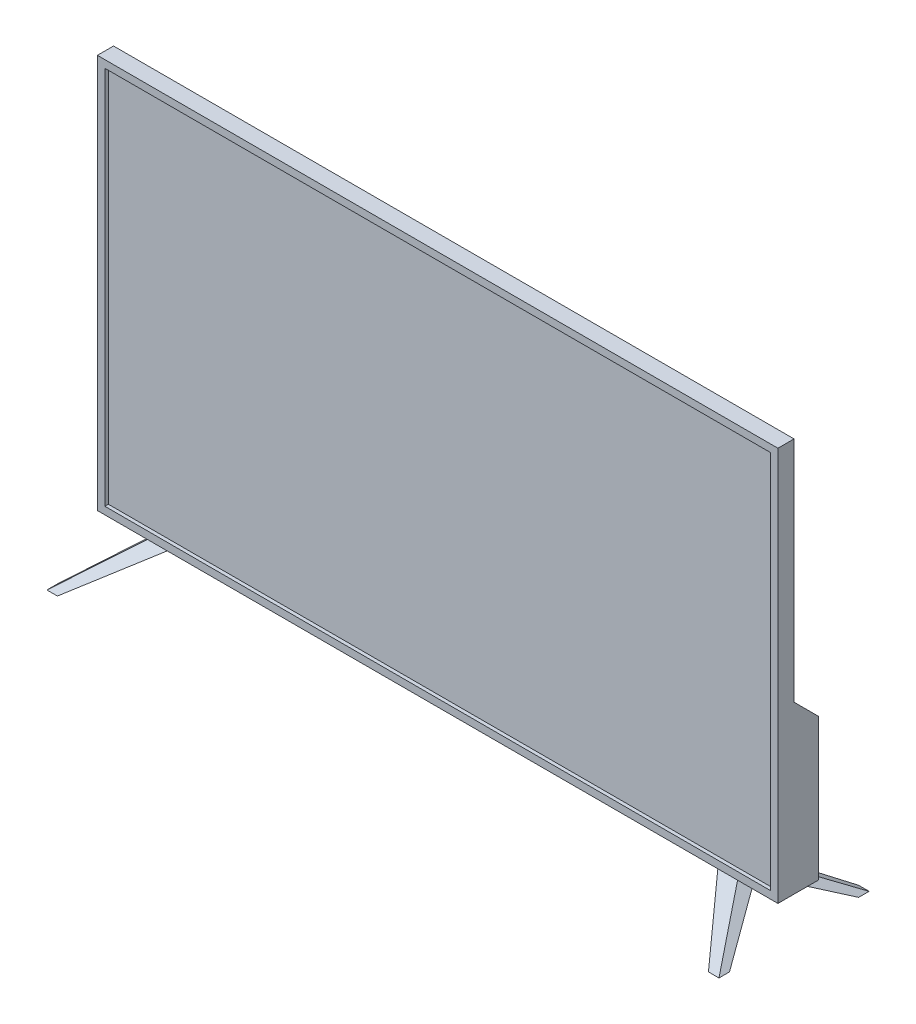
ISO-10303-21;
HEADER;
FILE_DESCRIPTION(('STEP AP214'),'2;1');
FILE_NAME('part.step','',(''),(''),'','','');
FILE_SCHEMA(('AUTOMOTIVE_DESIGN { 1 0 10303 214 1 1 1 1 }'));
ENDSEC;
DATA;
#1=APPLICATION_CONTEXT('core data for automotive mechanical design processes');
#2=APPLICATION_PROTOCOL_DEFINITION('international standard','automotive_design',2000,#1);
#3=PRODUCT_CONTEXT('',#1,'mechanical');
#4=PRODUCT('Part','Part','',(#3));
#5=PRODUCT_RELATED_PRODUCT_CATEGORY('part','',(#4));
#6=PRODUCT_DEFINITION_FORMATION('','',#4);
#7=PRODUCT_DEFINITION_CONTEXT('part definition',#1,'design');
#8=PRODUCT_DEFINITION('design','',#6,#7);
#9=PRODUCT_DEFINITION_SHAPE('','',#8);
#10=(LENGTH_UNIT() NAMED_UNIT(*) SI_UNIT(.MILLI.,.METRE.));
#11=(NAMED_UNIT(*) PLANE_ANGLE_UNIT() SI_UNIT($,.RADIAN.));
#12=(NAMED_UNIT(*) SI_UNIT($,.STERADIAN.) SOLID_ANGLE_UNIT());
#13=UNCERTAINTY_MEASURE_WITH_UNIT(LENGTH_MEASURE(1.E-05),#10,'distance_accuracy_value','');
#14=(GEOMETRIC_REPRESENTATION_CONTEXT(3) GLOBAL_UNCERTAINTY_ASSIGNED_CONTEXT((#13)) GLOBAL_UNIT_ASSIGNED_CONTEXT((#10,
#11,#12)) REPRESENTATION_CONTEXT('',''));
#15=CARTESIAN_POINT('',(0.,0.,0.));
#16=DIRECTION('',(0.,0.,1.));
#17=DIRECTION('',(1.,0.,0.));
#18=AXIS2_PLACEMENT_3D('',#15,#16,#17);
#19=CARTESIAN_POINT('',(608.33,-356.87,49.5299999999999));
#20=DIRECTION('',(0.,-0.866036909293288,-0.499980071344578));
#21=DIRECTION('',(0.,0.499980071344578,-0.866036909293288));
#22=AXIS2_PLACEMENT_3D('',#19,#20,#21);
#23=PLANE('',#22);
#24=DIRECTION('',(-1.,0.,0.));
#25=VECTOR('',#24,1.);
#26=CARTESIAN_POINT('',(608.33,-427.99,172.72));
#27=LINE('',#26,#25);
#28=CARTESIAN_POINT('',(-589.28,-427.99,172.72));
#29=VERTEX_POINT('',#28);
#30=CARTESIAN_POINT('',(-608.33,-427.99,172.72));
#31=VERTEX_POINT('',#30);
#32=EDGE_CURVE('E352',#29,#31,#27,.T.);
#33=ORIENTED_EDGE('',*,*,#32,.F.);
#34=DIRECTION('',(0.589493605926695,0.403870423537547,-0.699561269341824));
#35=VECTOR('',#34,1.);
#36=CARTESIAN_POINT('',(-105.373155365608,-96.4585629660364,-401.539810576688));
#37=LINE('',#36,#35);
#38=CARTESIAN_POINT('',(-485.472484494699,-356.87,49.5299999999999));
#39=VERTEX_POINT('',#38);
#40=EDGE_CURVE('E279',#29,#39,#37,.T.);
#41=ORIENTED_EDGE('',*,*,#40,.T.);
#42=DIRECTION('',(-1.,0.,0.));
#43=VECTOR('',#42,1.);
#44=CARTESIAN_POINT('',(608.33,-356.87,49.5299999999999));
#45=LINE('',#44,#43);
#46=CARTESIAN_POINT('',(-523.572484494699,-356.87,49.5300000000001));
#47=VERTEX_POINT('',#46);
#48=EDGE_CURVE('E356',#39,#47,#45,.T.);
#49=ORIENTED_EDGE('',*,*,#48,.T.);
#50=DIRECTION('',(-0.511873880846081,-0.429513184627224,0.743978194800729));
#51=VECTOR('',#50,1.);
#52=CARTESIAN_POINT('',(-226.997202288905,-108.013790084823,-381.524506460218));
#53=LINE('',#52,#51);
#54=EDGE_CURVE('E306',#47,#31,#53,.T.);
#55=ORIENTED_EDGE('',*,*,#54,.T.);
#56=EDGE_LOOP('',(#33,#41,#49,#55));
#57=FACE_BOUND('',#56,.T.);
#58=ADVANCED_FACE('F35',(#57),#23,.F.);
#59=CARTESIAN_POINT('',(608.33,-427.99,172.72));
#60=DIRECTION('',(0.,1.,0.));
#61=DIRECTION('',(0.,0.,1.));
#62=AXIS2_PLACEMENT_3D('',#59,#60,#61);
#63=PLANE('',#62);
#64=DIRECTION('',(-1.,0.,0.));
#65=VECTOR('',#64,1.);
#66=CARTESIAN_POINT('',(608.33,-427.99,153.67));
#67=LINE('',#66,#65);
#68=CARTESIAN_POINT('',(-589.28,-427.99,153.67));
#69=VERTEX_POINT('',#68);
#70=CARTESIAN_POINT('',(-608.33,-427.99,153.67));
#71=VERTEX_POINT('',#70);
#72=EDGE_CURVE('E348',#69,#71,#67,.T.);
#73=ORIENTED_EDGE('',*,*,#72,.F.);
#74=DIRECTION('',(0.,0.,1.));
#75=VECTOR('',#74,1.);
#76=CARTESIAN_POINT('',(-589.28,-427.99,-608.33));
#77=LINE('',#76,#75);
#78=EDGE_CURVE('E249',#69,#29,#77,.T.);
#79=ORIENTED_EDGE('',*,*,#78,.T.);
#80=ORIENTED_EDGE('',*,*,#32,.T.);
#81=DIRECTION('',(0.,0.,-1.));
#82=VECTOR('',#81,1.);
#83=CARTESIAN_POINT('',(-608.33,-427.99,172.72));
#84=LINE('',#83,#82);
#85=EDGE_CURVE('E324',#31,#71,#84,.T.);
#86=ORIENTED_EDGE('',*,*,#85,.T.);
#87=EDGE_LOOP('',(#73,#79,#80,#86));
#88=FACE_BOUND('',#87,.T.);
#89=ADVANCED_FACE('F415',(#88),#63,.F.);
#90=CARTESIAN_POINT('',(608.33,-427.99,153.67));
#91=DIRECTION('',(0.,0.894427190999916,0.447213595499957));
#92=DIRECTION('',(0.,-0.447213595499957,0.894427190999916));
#93=AXIS2_PLACEMENT_3D('',#90,#91,#92);
#94=PLANE('',#93);
#95=DIRECTION('',(-1.,0.,0.));
#96=VECTOR('',#95,1.);
#97=CARTESIAN_POINT('',(608.33,-372.409806331425,42.5096126628494));
#98=LINE('',#97,#96);
#99=CARTESIAN_POINT('',(-542.092104518393,-372.409806331425,42.5096126628494));
#100=VERTEX_POINT('',#99);
#101=CARTESIAN_POINT('',(-508.154552642882,-372.409806331425,42.5096126628494));
#102=VERTEX_POINT('',#101);
#103=EDGE_CURVE('E390',#100,#102,#98,.F.);
#104=ORIENTED_EDGE('',*,*,#103,.T.);
#105=DIRECTION('',(-0.546610749819654,-0.374490771096323,0.748981542192648));
#106=VECTOR('',#105,1.);
#107=CARTESIAN_POINT('',(-231.454117933161,-182.838417200641,-336.633165598719));
#108=LINE('',#107,#106);
#109=EDGE_CURVE('E273',#102,#69,#108,.T.);
#110=ORIENTED_EDGE('',*,*,#109,.T.);
#111=ORIENTED_EDGE('',*,*,#72,.T.);
#112=DIRECTION('',(0.470337492520406,0.394660016502715,-0.789320033005431));
#113=VECTOR('',#112,1.);
#114=CARTESIAN_POINT('',(-339.18369059008,-202.149431041413,-298.011137917175));
#115=LINE('',#114,#113);
#116=EDGE_CURVE('E300',#71,#100,#115,.T.);
#117=ORIENTED_EDGE('',*,*,#116,.T.);
#118=EDGE_LOOP('',(#104,#110,#111,#117));
#119=FACE_BOUND('',#118,.T.);
#120=ADVANCED_FACE('F405',(#119),#94,.F.);
#121=CARTESIAN_POINT('',(608.33,-369.57,36.8299999999999));
#122=DIRECTION('',(0.,0.894427190999916,-0.447213595499957));
#123=DIRECTION('',(0.,0.447213595499957,0.894427190999917));
#124=AXIS2_PLACEMENT_3D('',#121,#122,#123);
#125=PLANE('',#124);
#126=DIRECTION('',(-1.,0.,0.));
#127=VECTOR('',#126,1.);
#128=CARTESIAN_POINT('',(608.33,-427.99,-80.0100000000001));
#129=LINE('',#128,#127);
#130=CARTESIAN_POINT('',(-589.28,-427.99,-80.01));
#131=VERTEX_POINT('',#130);
#132=CARTESIAN_POINT('',(-608.33,-427.99,-80.01));
#133=VERTEX_POINT('',#132);
#134=EDGE_CURVE('E343',#131,#133,#129,.T.);
#135=ORIENTED_EDGE('',*,*,#134,.F.);
#136=DIRECTION('',(0.546610749819654,0.374490771096323,0.748981542192648));
#137=VECTOR('',#136,1.);
#138=CARTESIAN_POINT('',(-171.661048957707,-141.873338277072,492.223323445857));
#139=LINE('',#138,#137);
#140=CARTESIAN_POINT('',(-508.154552642881,-372.409806331425,31.1503873371504));
#141=VERTEX_POINT('',#140);
#142=EDGE_CURVE('E270',#131,#141,#139,.T.);
#143=ORIENTED_EDGE('',*,*,#142,.T.);
#144=DIRECTION('',(-1.,0.,0.));
#145=VECTOR('',#144,1.);
#146=CARTESIAN_POINT('',(-608.33,-372.409806331425,31.1503873371504));
#147=LINE('',#146,#145);
#148=CARTESIAN_POINT('',(-542.092104518393,-372.409806331425,31.1503873371504));
#149=VERTEX_POINT('',#148);
#150=EDGE_CURVE('E387',#141,#149,#147,.T.);
#151=ORIENTED_EDGE('',*,*,#150,.T.);
#152=DIRECTION('',(-0.470337492520405,-0.394660016502714,-0.789320033005431));
#153=VECTOR('',#152,1.);
#154=CARTESIAN_POINT('',(-284.963094702319,-156.652949029781,462.664101940439));
#155=LINE('',#154,#153);
#156=EDGE_CURVE('E297',#149,#133,#155,.T.);
#157=ORIENTED_EDGE('',*,*,#156,.T.);
#158=EDGE_LOOP('',(#135,#143,#151,#157));
#159=FACE_BOUND('',#158,.T.);
#160=ADVANCED_FACE('F433',(#159),#125,.F.);
#161=CARTESIAN_POINT('',(608.33,-427.99,-80.0100000000001));
#162=DIRECTION('',(0.,1.,0.));
#163=DIRECTION('',(0.,0.,1.));
#164=AXIS2_PLACEMENT_3D('',#161,#162,#163);
#165=PLANE('',#164);
#166=DIRECTION('',(-1.,0.,0.));
#167=VECTOR('',#166,1.);
#168=CARTESIAN_POINT('',(608.33,-427.99,-99.0600000000001));
#169=LINE('',#168,#167);
#170=CARTESIAN_POINT('',(-589.28,-427.99,-99.0600000000005));
#171=VERTEX_POINT('',#170);
#172=CARTESIAN_POINT('',(-608.33,-427.99,-99.06));
#173=VERTEX_POINT('',#172);
#174=EDGE_CURVE('E344',#171,#173,#169,.T.);
#175=ORIENTED_EDGE('',*,*,#174,.F.);
#176=EDGE_CURVE('E252',#171,#131,#77,.T.);
#177=ORIENTED_EDGE('',*,*,#176,.T.);
#178=ORIENTED_EDGE('',*,*,#134,.T.);
#179=DIRECTION('',(0.,0.,-1.));
#180=VECTOR('',#179,1.);
#181=CARTESIAN_POINT('',(-608.33,-427.99,-80.0100000000001));
#182=LINE('',#181,#180);
#183=EDGE_CURVE('E331',#133,#173,#182,.T.);
#184=ORIENTED_EDGE('',*,*,#183,.T.);
#185=EDGE_LOOP('',(#175,#177,#178,#184));
#186=FACE_BOUND('',#185,.T.);
#187=ADVANCED_FACE('F429',(#186),#165,.F.);
#188=CARTESIAN_POINT('',(608.33,-427.99,-99.0600000000001));
#189=DIRECTION('',(0.,-0.866036909293288,0.499980071344577));
#190=DIRECTION('',(0.,-0.499980071344578,-0.866036909293288));
#191=AXIS2_PLACEMENT_3D('',#188,#189,#190);
#192=PLANE('',#191);
#193=DIRECTION('',(-1.,0.,0.));
#194=VECTOR('',#193,1.);
#195=CARTESIAN_POINT('',(608.33,-356.87,24.1299999999999));
#196=LINE('',#195,#194);
#197=CARTESIAN_POINT('',(-485.472484494699,-356.87,24.13));
#198=VERTEX_POINT('',#197);
#199=CARTESIAN_POINT('',(-523.572484494699,-356.87,24.1299999999998));
#200=VERTEX_POINT('',#199);
#201=EDGE_CURVE('E333',#198,#200,#196,.T.);
#202=ORIENTED_EDGE('',*,*,#201,.F.);
#203=DIRECTION('',(-0.589493605926695,-0.403870423537547,-0.699561269341825));
#204=VECTOR('',#203,1.);
#205=CARTESIAN_POINT('',(-173.107277766165,-142.864170129245,394.818669597559));
#206=LINE('',#205,#204);
#207=EDGE_CURVE('E276',#198,#171,#206,.T.);
#208=ORIENTED_EDGE('',*,*,#207,.T.);
#209=ORIENTED_EDGE('',*,*,#174,.T.);
#210=DIRECTION('',(0.51187388084608,0.429513184627224,0.74397819480073));
#211=VECTOR('',#210,1.);
#212=CARTESIAN_POINT('',(-289.546988396679,-160.499292538074,364.272118282266));
#213=LINE('',#212,#211);
#214=EDGE_CURVE('E303',#173,#200,#213,.T.);
#215=ORIENTED_EDGE('',*,*,#214,.T.);
#216=EDGE_LOOP('',(#202,#208,#209,#215));
#217=FACE_BOUND('',#216,.T.);
#218=ADVANCED_FACE('F425',(#217),#192,.F.);
#219=CARTESIAN_POINT('',(608.33,-383.769031657124,36.8299999999999));
#220=DIRECTION('',(1.,0.,0.));
#221=DIRECTION('',(0.,0.,-1.));
#222=AXIS2_PLACEMENT_3D('',#219,#220,#221);
#223=CYLINDRICAL_SURFACE('',#222,12.7);
#224=ORIENTED_EDGE('',*,*,#150,.F.);
#225=CARTESIAN_POINT('',(-524.734599874683,-383.769031657124,36.8299999999999));
#226=DIRECTION('',(-0.565191572928759,0.824959687433462,0.));
#227=DIRECTION('',(0.824959687433462,0.565191572928759,0.));
#228=AXIS2_PLACEMENT_3D('',#225,#226,#227);
#229=ELLIPSE('',#228,22.4702571805698,12.7);
#230=EDGE_CURVE('E43',#141,#102,#229,.F.);
#231=ORIENTED_EDGE('',*,*,#230,.T.);
#232=ORIENTED_EDGE('',*,*,#103,.F.);
#233=CARTESIAN_POINT('',(-555.629502109382,-383.769031657124,36.8299999999999));
#234=DIRECTION('',(0.642787609686535,-0.766044443118982,0.));
#235=DIRECTION('',(0.766044443118982,0.642787609686535,0.));
#236=AXIS2_PLACEMENT_3D('',#233,#234,#235);
#237=ELLIPSE('',#236,19.7576926011274,12.7);
#238=EDGE_CURVE('E393',#100,#149,#237,.F.);
#239=ORIENTED_EDGE('',*,*,#238,.T.);
#240=EDGE_LOOP('',(#224,#231,#232,#239));
#241=FACE_BOUND('',#240,.T.);
#242=ADVANCED_FACE('F402',(#241),#223,.F.);
#243=CARTESIAN_POINT('',(-615.95,356.87,73.66));
#244=DIRECTION('',(1.,0.,0.));
#245=DIRECTION('',(0.,0.,-1.));
#246=AXIS2_PLACEMENT_3D('',#243,#244,#245);
#247=PLANE('',#246);
#248=DIRECTION('',(0.,-1.,0.));
#249=VECTOR('',#248,1.);
#250=CARTESIAN_POINT('',(-615.95,356.87,44.45));
#251=LINE('',#250,#249);
#252=CARTESIAN_POINT('',(-615.95,356.87,44.45));
#253=VERTEX_POINT('',#252);
#254=CARTESIAN_POINT('',(-615.95,-55.8799999999995,44.4499999999999));
#255=VERTEX_POINT('',#254);
#256=EDGE_CURVE('E310',#253,#255,#251,.T.);
#257=ORIENTED_EDGE('',*,*,#256,.T.);
#258=DIRECTION('',(0.,-0.707106781186551,-0.707106781186544));
#259=VECTOR('',#258,1.);
#260=CARTESIAN_POINT('',(-615.95,-100.33,0.));
#261=LINE('',#260,#259);
#262=CARTESIAN_POINT('',(-615.95,-100.33,0.));
#263=VERTEX_POINT('',#262);
#264=EDGE_CURVE('E313',#255,#263,#261,.T.);
#265=ORIENTED_EDGE('',*,*,#264,.T.);
#266=DIRECTION('',(0.,-1.,0.));
#267=VECTOR('',#266,1.);
#268=CARTESIAN_POINT('',(-615.95,356.87,0.));
#269=LINE('',#268,#267);
#270=CARTESIAN_POINT('',(-615.95,-356.87,0.));
#271=VERTEX_POINT('',#270);
#272=EDGE_CURVE('E370',#263,#271,#269,.T.);
#273=ORIENTED_EDGE('',*,*,#272,.T.);
#274=DIRECTION('',(0.,0.,-1.));
#275=VECTOR('',#274,1.);
#276=CARTESIAN_POINT('',(-615.95,-356.87,73.66));
#277=LINE('',#276,#275);
#278=CARTESIAN_POINT('',(-615.95,-356.87,73.66));
#279=VERTEX_POINT('',#278);
#280=EDGE_CURVE('E384',#279,#271,#277,.T.);
#281=ORIENTED_EDGE('',*,*,#280,.F.);
#282=DIRECTION('',(0.,-1.,0.));
#283=VECTOR('',#282,1.);
#284=CARTESIAN_POINT('',(-615.95,356.87,73.66));
#285=LINE('',#284,#283);
#286=CARTESIAN_POINT('',(-615.95,356.87,73.66));
#287=VERTEX_POINT('',#286);
#288=EDGE_CURVE('E359',#287,#279,#285,.T.);
#289=ORIENTED_EDGE('',*,*,#288,.F.);
#290=DIRECTION('',(0.,0.,-1.));
#291=VECTOR('',#290,1.);
#292=CARTESIAN_POINT('',(-615.95,356.87,73.66));
#293=LINE('',#292,#291);
#294=EDGE_CURVE('E369',#287,#253,#293,.T.);
#295=ORIENTED_EDGE('',*,*,#294,.T.);
#296=EDGE_LOOP('',(#257,#265,#273,#281,#289,#295));
#297=FACE_BOUND('',#296,.T.);
#298=ADVANCED_FACE('F635',(#297),#247,.F.);
#299=CARTESIAN_POINT('',(615.95,-356.87,73.66));
#300=DIRECTION('',(0.,1.,0.));
#301=DIRECTION('',(0.,0.,1.));
#302=AXIS2_PLACEMENT_3D('',#299,#300,#301);
#303=PLANE('',#302);
#304=DIRECTION('',(1.,0.,0.));
#305=VECTOR('',#304,1.);
#306=CARTESIAN_POINT('',(615.95,-356.87,0.));
#307=LINE('',#306,#305);
#308=CARTESIAN_POINT('',(615.95,-356.87,0.));
#309=VERTEX_POINT('',#308);
#310=EDGE_CURVE('E372',#271,#309,#307,.T.);
#311=ORIENTED_EDGE('',*,*,#310,.T.);
#312=DIRECTION('',(0.,0.,-1.));
#313=VECTOR('',#312,1.);
#314=CARTESIAN_POINT('',(615.95,-356.87,73.66));
#315=LINE('',#314,#313);
#316=CARTESIAN_POINT('',(615.95,-356.87,73.66));
#317=VERTEX_POINT('',#316);
#318=EDGE_CURVE('E381',#317,#309,#315,.T.);
#319=ORIENTED_EDGE('',*,*,#318,.F.);
#320=DIRECTION('',(1.,0.,0.));
#321=VECTOR('',#320,1.);
#322=CARTESIAN_POINT('',(615.95,-356.87,73.66));
#323=LINE('',#322,#321);
#324=EDGE_CURVE('E362',#279,#317,#323,.T.);
#325=ORIENTED_EDGE('',*,*,#324,.F.);
#326=ORIENTED_EDGE('',*,*,#280,.T.);
#327=EDGE_LOOP('',(#311,#319,#325,#326));
#328=FACE_BOUND('',#327,.T.);
#329=DIRECTION('',(0.,0.,1.));
#330=VECTOR('',#329,1.);
#331=CARTESIAN_POINT('',(523.572484494699,-356.87,-608.33));
#332=LINE('',#331,#330);
#333=CARTESIAN_POINT('',(523.572484494699,-356.87,24.1300000000001));
#334=VERTEX_POINT('',#333);
#335=CARTESIAN_POINT('',(523.572484494699,-356.87,49.5299999999997));
#336=VERTEX_POINT('',#335);
#337=EDGE_CURVE('E243',#334,#336,#332,.T.);
#338=ORIENTED_EDGE('',*,*,#337,.F.);
#339=CARTESIAN_POINT('',(485.472484494699,-356.87,24.13));
#340=VERTEX_POINT('',#339);
#341=EDGE_CURVE('E339',#334,#340,#196,.T.);
#342=ORIENTED_EDGE('',*,*,#341,.T.);
#343=DIRECTION('',(0.,0.,1.));
#344=VECTOR('',#343,1.);
#345=CARTESIAN_POINT('',(485.472484494699,-356.87,-608.33));
#346=LINE('',#345,#344);
#347=CARTESIAN_POINT('',(485.472484494699,-356.87,49.5299999999999));
#348=VERTEX_POINT('',#347);
#349=EDGE_CURVE('E255',#340,#348,#346,.T.);
#350=ORIENTED_EDGE('',*,*,#349,.T.);
#351=EDGE_CURVE('E358',#336,#348,#45,.T.);
#352=ORIENTED_EDGE('',*,*,#351,.F.);
#353=EDGE_LOOP('',(#338,#342,#350,#352));
#354=FACE_BOUND('',#353,.T.);
#355=DIRECTION('',(0.,0.,1.));
#356=VECTOR('',#355,1.);
#357=CARTESIAN_POINT('',(-485.472484494699,-356.87,-608.33));
#358=LINE('',#357,#356);
#359=EDGE_CURVE('E253',#198,#39,#358,.T.);
#360=ORIENTED_EDGE('',*,*,#359,.F.);
#361=ORIENTED_EDGE('',*,*,#201,.T.);
#362=DIRECTION('',(0.,0.,1.));
#363=VECTOR('',#362,1.);
#364=CARTESIAN_POINT('',(-523.572484494699,-356.87,-608.33));
#365=LINE('',#364,#363);
#366=EDGE_CURVE('E294',#200,#47,#365,.T.);
#367=ORIENTED_EDGE('',*,*,#366,.T.);
#368=ORIENTED_EDGE('',*,*,#48,.F.);
#369=EDGE_LOOP('',(#360,#361,#367,#368));
#370=FACE_BOUND('',#369,.T.);
#371=ADVANCED_FACE('F422',(#328,#354,#370),#303,.F.);
#372=CARTESIAN_POINT('',(615.95,356.87,73.66));
#373=DIRECTION('',(-1.,0.,0.));
#374=DIRECTION('',(0.,0.,1.));
#375=AXIS2_PLACEMENT_3D('',#372,#373,#374);
#376=PLANE('',#375);
#377=DIRECTION('',(0.,1.,0.));
#378=VECTOR('',#377,1.);
#379=CARTESIAN_POINT('',(615.95,356.87,0.));
#380=LINE('',#379,#378);
#381=CARTESIAN_POINT('',(615.95,-100.33,0.));
#382=VERTEX_POINT('',#381);
#383=EDGE_CURVE('E363',#309,#382,#380,.T.);
#384=ORIENTED_EDGE('',*,*,#383,.T.);
#385=DIRECTION('',(0.,-0.707106781186551,-0.707106781186544));
#386=VECTOR('',#385,1.);
#387=CARTESIAN_POINT('',(615.95,-100.33,0.));
#388=LINE('',#387,#386);
#389=CARTESIAN_POINT('',(615.95,-55.8799999999995,44.4499999999999));
#390=VERTEX_POINT('',#389);
#391=EDGE_CURVE('E314',#390,#382,#388,.T.);
#392=ORIENTED_EDGE('',*,*,#391,.F.);
#393=DIRECTION('',(0.,-1.,0.));
#394=VECTOR('',#393,1.);
#395=CARTESIAN_POINT('',(615.95,356.87,44.45));
#396=LINE('',#395,#394);
#397=CARTESIAN_POINT('',(615.95,356.87,44.45));
#398=VERTEX_POINT('',#397);
#399=EDGE_CURVE('E309',#398,#390,#396,.T.);
#400=ORIENTED_EDGE('',*,*,#399,.F.);
#401=DIRECTION('',(0.,0.,-1.));
#402=VECTOR('',#401,1.);
#403=CARTESIAN_POINT('',(615.95,356.87,73.66));
#404=LINE('',#403,#402);
#405=CARTESIAN_POINT('',(615.95,356.87,73.66));
#406=VERTEX_POINT('',#405);
#407=EDGE_CURVE('E378',#406,#398,#404,.T.);
#408=ORIENTED_EDGE('',*,*,#407,.F.);
#409=DIRECTION('',(0.,1.,0.));
#410=VECTOR('',#409,1.);
#411=CARTESIAN_POINT('',(615.95,356.87,73.66));
#412=LINE('',#411,#410);
#413=EDGE_CURVE('E365',#317,#406,#412,.T.);
#414=ORIENTED_EDGE('',*,*,#413,.F.);
#415=ORIENTED_EDGE('',*,*,#318,.T.);
#416=EDGE_LOOP('',(#384,#392,#400,#408,#414,#415));
#417=FACE_BOUND('',#416,.T.);
#418=ADVANCED_FACE('F643',(#417),#376,.F.);
#419=CARTESIAN_POINT('',(615.95,356.87,73.66));
#420=DIRECTION('',(0.,-1.,0.));
#421=DIRECTION('',(0.,0.,-1.));
#422=AXIS2_PLACEMENT_3D('',#419,#420,#421);
#423=PLANE('',#422);
#424=ORIENTED_EDGE('',*,*,#407,.T.);
#425=DIRECTION('',(1.,0.,0.));
#426=VECTOR('',#425,1.);
#427=CARTESIAN_POINT('',(-615.95,356.87,44.45));
#428=LINE('',#427,#426);
#429=EDGE_CURVE('E317',#253,#398,#428,.T.);
#430=ORIENTED_EDGE('',*,*,#429,.F.);
#431=ORIENTED_EDGE('',*,*,#294,.F.);
#432=DIRECTION('',(-1.,0.,0.));
#433=VECTOR('',#432,1.);
#434=CARTESIAN_POINT('',(615.95,356.87,73.66));
#435=LINE('',#434,#433);
#436=EDGE_CURVE('E367',#406,#287,#435,.T.);
#437=ORIENTED_EDGE('',*,*,#436,.F.);
#438=EDGE_LOOP('',(#424,#430,#431,#437));
#439=FACE_BOUND('',#438,.T.);
#440=ADVANCED_FACE('F577',(#439),#423,.F.);
#441=CARTESIAN_POINT('',(0.,0.,73.66));
#442=DIRECTION('',(0.,0.,-1.));
#443=DIRECTION('',(-1.,0.,0.));
#444=AXIS2_PLACEMENT_3D('',#441,#442,#443);
#445=PLANE('',#444);
#446=DIRECTION('',(1.,0.,0.));
#447=VECTOR('',#446,1.);
#448=CARTESIAN_POINT('',(602.440662507466,-343.360662507466,73.66));
#449=LINE('',#448,#447);
#450=CARTESIAN_POINT('',(-602.440662507466,-343.360662507466,73.66));
#451=VERTEX_POINT('',#450);
#452=CARTESIAN_POINT('',(602.440662507466,-343.360662507466,73.66));
#453=VERTEX_POINT('',#452);
#454=EDGE_CURVE('E237',#451,#453,#449,.T.);
#455=ORIENTED_EDGE('',*,*,#454,.F.);
#456=DIRECTION('',(0.,-1.,0.));
#457=VECTOR('',#456,1.);
#458=CARTESIAN_POINT('',(-602.440662507466,343.360662507466,73.66));
#459=LINE('',#458,#457);
#460=CARTESIAN_POINT('',(-602.440662507466,343.360662507466,73.66));
#461=VERTEX_POINT('',#460);
#462=EDGE_CURVE('E50',#461,#451,#459,.T.);
#463=ORIENTED_EDGE('',*,*,#462,.F.);
#464=DIRECTION('',(-1.,0.,0.));
#465=VECTOR('',#464,1.);
#466=CARTESIAN_POINT('',(602.440662507466,343.360662507466,73.66));
#467=LINE('',#466,#465);
#468=CARTESIAN_POINT('',(602.440662507466,343.360662507466,73.66));
#469=VERTEX_POINT('',#468);
#470=EDGE_CURVE('E228',#469,#461,#467,.T.);
#471=ORIENTED_EDGE('',*,*,#470,.F.);
#472=DIRECTION('',(0.,1.,0.));
#473=VECTOR('',#472,1.);
#474=CARTESIAN_POINT('',(602.440662507466,343.360662507466,73.66));
#475=LINE('',#474,#473);
#476=EDGE_CURVE('E231',#453,#469,#475,.T.);
#477=ORIENTED_EDGE('',*,*,#476,.F.);
#478=EDGE_LOOP('',(#455,#463,#471,#477));
#479=FACE_BOUND('',#478,.T.);
#480=ORIENTED_EDGE('',*,*,#288,.T.);
#481=ORIENTED_EDGE('',*,*,#324,.T.);
#482=ORIENTED_EDGE('',*,*,#413,.T.);
#483=ORIENTED_EDGE('',*,*,#436,.T.);
#484=EDGE_LOOP('',(#480,#481,#482,#483));
#485=FACE_BOUND('',#484,.T.);
#486=ADVANCED_FACE('F465',(#479,#485),#445,.F.);
#487=CARTESIAN_POINT('',(0.,0.,0.));
#488=DIRECTION('',(0.,0.,-1.));
#489=DIRECTION('',(-1.,0.,0.));
#490=AXIS2_PLACEMENT_3D('',#487,#488,#489);
#491=PLANE('',#490);
#492=DIRECTION('',(1.,0.,0.));
#493=VECTOR('',#492,1.);
#494=CARTESIAN_POINT('',(-615.95,-100.33,0.));
#495=LINE('',#494,#493);
#496=EDGE_CURVE('E321',#263,#382,#495,.T.);
#497=ORIENTED_EDGE('',*,*,#496,.T.);
#498=ORIENTED_EDGE('',*,*,#383,.F.);
#499=ORIENTED_EDGE('',*,*,#310,.F.);
#500=ORIENTED_EDGE('',*,*,#272,.F.);
#501=EDGE_LOOP('',(#497,#498,#499,#500));
#502=FACE_BOUND('',#501,.T.);
#503=ADVANCED_FACE('F457',(#502),#491,.T.);
#504=CARTESIAN_POINT('',(608.33,-427.99,172.72));
#505=VERTEX_POINT('',#504);
#506=CARTESIAN_POINT('',(589.28,-427.99,172.72));
#507=VERTEX_POINT('',#506);
#508=EDGE_CURVE('E353',#505,#507,#27,.T.);
#509=ORIENTED_EDGE('',*,*,#508,.F.);
#510=DIRECTION('',(-0.51187388084608,0.429513184627225,-0.74397819480073));
#511=VECTOR('',#510,1.);
#512=CARTESIAN_POINT('',(545.780213892226,-375.504497546749,81.807611822048));
#513=LINE('',#512,#511);
#514=EDGE_CURVE('E291',#505,#336,#513,.T.);
#515=ORIENTED_EDGE('',*,*,#514,.T.);
#516=ORIENTED_EDGE('',*,*,#351,.T.);
#517=DIRECTION('',(0.589493605926695,-0.403870423537547,0.699561269341824));
#518=VECTOR('',#517,1.);
#519=CARTESIAN_POINT('',(528.165804252155,-386.119798402074,100.194829375021));
#520=LINE('',#519,#518);
#521=EDGE_CURVE('E267',#348,#507,#520,.T.);
#522=ORIENTED_EDGE('',*,*,#521,.T.);
#523=EDGE_LOOP('',(#509,#515,#516,#522));
#524=FACE_BOUND('',#523,.T.);
#525=ADVANCED_FACE('F449',(#524),#23,.F.);
#526=ORIENTED_EDGE('',*,*,#508,.T.);
#527=DIRECTION('',(0.,0.,1.));
#528=VECTOR('',#527,1.);
#529=CARTESIAN_POINT('',(589.28,-427.99,-608.33));
#530=LINE('',#529,#528);
#531=CARTESIAN_POINT('',(589.28,-427.99,153.669999999999));
#532=VERTEX_POINT('',#531);
#533=EDGE_CURVE('E248',#532,#507,#530,.T.);
#534=ORIENTED_EDGE('',*,*,#533,.F.);
#535=CARTESIAN_POINT('',(608.33,-427.99,153.67));
#536=VERTEX_POINT('',#535);
#537=EDGE_CURVE('E349',#536,#532,#67,.T.);
#538=ORIENTED_EDGE('',*,*,#537,.F.);
#539=DIRECTION('',(0.,0.,-1.));
#540=VECTOR('',#539,1.);
#541=CARTESIAN_POINT('',(608.33,-427.99,172.72));
#542=LINE('',#541,#540);
#543=EDGE_CURVE('E328',#505,#536,#542,.T.);
#544=ORIENTED_EDGE('',*,*,#543,.F.);
#545=EDGE_LOOP('',(#526,#534,#538,#544));
#546=FACE_BOUND('',#545,.T.);
#547=ADVANCED_FACE('F454',(#546),#63,.F.);
#548=CARTESIAN_POINT('',(508.154552642882,-372.409806331425,42.5096126628494));
#549=VERTEX_POINT('',#548);
#550=CARTESIAN_POINT('',(542.092104518393,-372.409806331425,42.5096126628494));
#551=VERTEX_POINT('',#550);
#552=EDGE_CURVE('E394',#549,#551,#98,.F.);
#553=ORIENTED_EDGE('',*,*,#552,.T.);
#554=DIRECTION('',(0.470337492520405,-0.394660016502715,0.789320033005431));
#555=VECTOR('',#554,1.);
#556=CARTESIAN_POINT('',(608.33,-427.99,153.67));
#557=LINE('',#556,#555);
#558=EDGE_CURVE('E285',#551,#536,#557,.T.);
#559=ORIENTED_EDGE('',*,*,#558,.T.);
#560=ORIENTED_EDGE('',*,*,#537,.T.);
#561=DIRECTION('',(-0.546610749819654,0.374490771096323,-0.748981542192648));
#562=VECTOR('',#561,1.);
#563=CARTESIAN_POINT('',(594.971822090141,-431.88954797666,161.46909595332));
#564=LINE('',#563,#562);
#565=EDGE_CURVE('E261',#532,#549,#564,.T.);
#566=ORIENTED_EDGE('',*,*,#565,.T.);
#567=EDGE_LOOP('',(#553,#559,#560,#566));
#568=FACE_BOUND('',#567,.T.);
#569=ADVANCED_FACE('F463',(#568),#94,.F.);
#570=CARTESIAN_POINT('',(608.33,-427.99,-80.0100000000002));
#571=VERTEX_POINT('',#570);
#572=CARTESIAN_POINT('',(589.28,-427.99,-80.01));
#573=VERTEX_POINT('',#572);
#574=EDGE_CURVE('E345',#571,#573,#129,.T.);
#575=ORIENTED_EDGE('',*,*,#574,.F.);
#576=DIRECTION('',(-0.470337492520405,0.394660016502715,0.789320033005432));
#577=VECTOR('',#576,1.);
#578=CARTESIAN_POINT('',(554.109404112239,-382.493517988368,10.9829640232645));
#579=LINE('',#578,#577);
#580=CARTESIAN_POINT('',(542.092104518393,-372.409806331425,31.1503873371504));
#581=VERTEX_POINT('',#580);
#582=EDGE_CURVE('E282',#571,#581,#579,.T.);
#583=ORIENTED_EDGE('',*,*,#582,.T.);
#584=CARTESIAN_POINT('',(508.154552642882,-372.409806331425,31.1503873371504));
#585=VERTEX_POINT('',#584);
#586=EDGE_CURVE('E389',#581,#585,#147,.T.);
#587=ORIENTED_EDGE('',*,*,#586,.T.);
#588=DIRECTION('',(0.546610749819654,-0.374490771096323,-0.748981542192648));
#589=VECTOR('',#588,1.);
#590=CARTESIAN_POINT('',(535.178753114687,-390.924469053091,-5.87893810618234));
#591=LINE('',#590,#589);
#592=EDGE_CURVE('E58',#585,#573,#591,.T.);
#593=ORIENTED_EDGE('',*,*,#592,.T.);
#594=EDGE_LOOP('',(#575,#583,#587,#593));
#595=FACE_BOUND('',#594,.T.);
#596=ADVANCED_FACE('F483',(#595),#125,.F.);
#597=ORIENTED_EDGE('',*,*,#574,.T.);
#598=CARTESIAN_POINT('',(589.28,-427.99,-99.0599999999998));
#599=VERTEX_POINT('',#598);
#600=EDGE_CURVE('E258',#599,#573,#530,.T.);
#601=ORIENTED_EDGE('',*,*,#600,.F.);
#602=CARTESIAN_POINT('',(608.33,-427.99,-99.06));
#603=VERTEX_POINT('',#602);
#604=EDGE_CURVE('E340',#603,#599,#169,.T.);
#605=ORIENTED_EDGE('',*,*,#604,.F.);
#606=DIRECTION('',(0.,0.,-1.));
#607=VECTOR('',#606,1.);
#608=CARTESIAN_POINT('',(608.33,-427.99,-80.0100000000001));
#609=LINE('',#608,#607);
#610=EDGE_CURVE('E330',#571,#603,#609,.T.);
#611=ORIENTED_EDGE('',*,*,#610,.F.);
#612=EDGE_LOOP('',(#597,#601,#605,#611));
#613=FACE_BOUND('',#612,.T.);
#614=ADVANCED_FACE('F493',(#613),#165,.F.);
#615=ORIENTED_EDGE('',*,*,#341,.F.);
#616=DIRECTION('',(0.51187388084608,-0.429513184627224,-0.74397819480073));
#617=VECTOR('',#616,1.);
#618=CARTESIAN_POINT('',(608.33,-427.99,-99.0600000000001));
#619=LINE('',#618,#617);
#620=EDGE_CURVE('E288',#334,#603,#619,.T.);
#621=ORIENTED_EDGE('',*,*,#620,.T.);
#622=ORIENTED_EDGE('',*,*,#604,.T.);
#623=DIRECTION('',(-0.589493605926695,0.403870423537547,0.699561269341825));
#624=VECTOR('',#623,1.);
#625=CARTESIAN_POINT('',(595.899926652712,-432.525405565282,-106.91597035415));
#626=LINE('',#625,#624);
#627=EDGE_CURVE('E264',#599,#340,#626,.T.);
#628=ORIENTED_EDGE('',*,*,#627,.T.);
#629=EDGE_LOOP('',(#615,#621,#622,#628));
#630=FACE_BOUND('',#629,.T.);
#631=ADVANCED_FACE('F489',(#630),#192,.F.);
#632=ORIENTED_EDGE('',*,*,#586,.F.);
#633=CARTESIAN_POINT('',(555.629502109382,-383.769031657124,36.8299999999999));
#634=DIRECTION('',(-0.642787609686536,-0.766044443118981,0.));
#635=DIRECTION('',(0.766044443118981,-0.642787609686536,0.));
#636=AXIS2_PLACEMENT_3D('',#633,#634,#635);
#637=ELLIPSE('',#636,19.7576926011273,12.7);
#638=EDGE_CURVE('E11',#581,#551,#637,.F.);
#639=ORIENTED_EDGE('',*,*,#638,.T.);
#640=ORIENTED_EDGE('',*,*,#552,.F.);
#641=CARTESIAN_POINT('',(524.734599874683,-383.769031657124,36.8299999999999));
#642=DIRECTION('',(0.565191572928759,0.824959687433462,0.));
#643=DIRECTION('',(0.824959687433462,-0.565191572928759,0.));
#644=AXIS2_PLACEMENT_3D('',#641,#642,#643);
#645=ELLIPSE('',#644,22.4702571805698,12.7);
#646=EDGE_CURVE('E397',#549,#585,#645,.F.);
#647=ORIENTED_EDGE('',*,*,#646,.T.);
#648=EDGE_LOOP('',(#632,#639,#640,#647));
#649=FACE_BOUND('',#648,.T.);
#650=ADVANCED_FACE('F37',(#649),#223,.F.);
#651=CARTESIAN_POINT('',(-615.95,-100.33,0.));
#652=DIRECTION('',(0.,-0.707106781186544,0.707106781186551));
#653=DIRECTION('',(0.,-0.707106781186551,-0.707106781186544));
#654=AXIS2_PLACEMENT_3D('',#651,#652,#653);
#655=PLANE('',#654);
#656=ORIENTED_EDGE('',*,*,#391,.T.);
#657=ORIENTED_EDGE('',*,*,#496,.F.);
#658=ORIENTED_EDGE('',*,*,#264,.F.);
#659=DIRECTION('',(1.,0.,0.));
#660=VECTOR('',#659,1.);
#661=CARTESIAN_POINT('',(-615.95,-55.8799999999995,44.4499999999999));
#662=LINE('',#661,#660);
#663=EDGE_CURVE('E325',#255,#390,#662,.T.);
#664=ORIENTED_EDGE('',*,*,#663,.T.);
#665=EDGE_LOOP('',(#656,#657,#658,#664));
#666=FACE_BOUND('',#665,.T.);
#667=ADVANCED_FACE('F540',(#666),#655,.F.);
#668=CARTESIAN_POINT('',(-615.95,356.87,44.45));
#669=DIRECTION('',(0.,0.,1.));
#670=DIRECTION('',(0.,-1.,0.));
#671=AXIS2_PLACEMENT_3D('',#668,#669,#670);
#672=PLANE('',#671);
#673=ORIENTED_EDGE('',*,*,#399,.T.);
#674=ORIENTED_EDGE('',*,*,#663,.F.);
#675=ORIENTED_EDGE('',*,*,#256,.F.);
#676=ORIENTED_EDGE('',*,*,#429,.T.);
#677=EDGE_LOOP('',(#673,#674,#675,#676));
#678=FACE_BOUND('',#677,.T.);
#679=ADVANCED_FACE('F444',(#678),#672,.F.);
#680=CARTESIAN_POINT('',(-608.33,-427.99,-608.33));
#681=DIRECTION('',(0.642787609686535,-0.766044443118982,0.));
#682=DIRECTION('',(0.766044443118982,0.642787609686535,0.));
#683=AXIS2_PLACEMENT_3D('',#680,#681,#682);
#684=PLANE('',#683);
#685=ORIENTED_EDGE('',*,*,#366,.F.);
#686=ORIENTED_EDGE('',*,*,#214,.F.);
#687=ORIENTED_EDGE('',*,*,#183,.F.);
#688=ORIENTED_EDGE('',*,*,#156,.F.);
#689=ORIENTED_EDGE('',*,*,#238,.F.);
#690=ORIENTED_EDGE('',*,*,#116,.F.);
#691=ORIENTED_EDGE('',*,*,#85,.F.);
#692=ORIENTED_EDGE('',*,*,#54,.F.);
#693=EDGE_LOOP('',(#685,#686,#687,#688,#689,#690,#691,#692));
#694=FACE_BOUND('',#693,.T.);
#695=ADVANCED_FACE('F411',(#694),#684,.F.);
#696=CARTESIAN_POINT('',(-589.28,-427.99,-608.33));
#697=DIRECTION('',(-0.565191572928759,0.824959687433462,0.));
#698=DIRECTION('',(-0.824959687433462,-0.565191572928759,0.));
#699=AXIS2_PLACEMENT_3D('',#696,#697,#698);
#700=PLANE('',#699);
#701=ORIENTED_EDGE('',*,*,#78,.F.);
#702=ORIENTED_EDGE('',*,*,#109,.F.);
#703=ORIENTED_EDGE('',*,*,#230,.F.);
#704=ORIENTED_EDGE('',*,*,#142,.F.);
#705=ORIENTED_EDGE('',*,*,#176,.F.);
#706=ORIENTED_EDGE('',*,*,#207,.F.);
#707=ORIENTED_EDGE('',*,*,#359,.T.);
#708=ORIENTED_EDGE('',*,*,#40,.F.);
#709=EDGE_LOOP('',(#701,#702,#703,#704,#705,#706,#707,#708));
#710=FACE_BOUND('',#709,.T.);
#711=ADVANCED_FACE('F434',(#710),#700,.F.);
#712=CARTESIAN_POINT('',(589.28,-427.99,-608.33));
#713=DIRECTION('',(0.565191572928759,0.824959687433462,0.));
#714=DIRECTION('',(-0.824959687433462,0.565191572928759,0.));
#715=AXIS2_PLACEMENT_3D('',#712,#713,#714);
#716=PLANE('',#715);
#717=ORIENTED_EDGE('',*,*,#349,.F.);
#718=ORIENTED_EDGE('',*,*,#627,.F.);
#719=ORIENTED_EDGE('',*,*,#600,.T.);
#720=ORIENTED_EDGE('',*,*,#592,.F.);
#721=ORIENTED_EDGE('',*,*,#646,.F.);
#722=ORIENTED_EDGE('',*,*,#565,.F.);
#723=ORIENTED_EDGE('',*,*,#533,.T.);
#724=ORIENTED_EDGE('',*,*,#521,.F.);
#725=EDGE_LOOP('',(#717,#718,#719,#720,#721,#722,#723,#724));
#726=FACE_BOUND('',#725,.T.);
#727=ADVANCED_FACE('F436',(#726),#716,.F.);
#728=CARTESIAN_POINT('',(608.33,-427.99,-608.33));
#729=DIRECTION('',(-0.642787609686536,-0.766044443118981,0.));
#730=DIRECTION('',(0.766044443118981,-0.642787609686536,0.));
#731=AXIS2_PLACEMENT_3D('',#728,#729,#730);
#732=PLANE('',#731);
#733=ORIENTED_EDGE('',*,*,#543,.T.);
#734=ORIENTED_EDGE('',*,*,#558,.F.);
#735=ORIENTED_EDGE('',*,*,#638,.F.);
#736=ORIENTED_EDGE('',*,*,#582,.F.);
#737=ORIENTED_EDGE('',*,*,#610,.T.);
#738=ORIENTED_EDGE('',*,*,#620,.F.);
#739=ORIENTED_EDGE('',*,*,#337,.T.);
#740=ORIENTED_EDGE('',*,*,#514,.F.);
#741=EDGE_LOOP('',(#733,#734,#735,#736,#737,#738,#739,#740));
#742=FACE_BOUND('',#741,.T.);
#743=ADVANCED_FACE('F442',(#742),#732,.F.);
#744=CARTESIAN_POINT('',(-602.440662507466,343.360662507466,67.31));
#745=DIRECTION('',(-1.,0.,0.));
#746=DIRECTION('',(0.,0.,1.));
#747=AXIS2_PLACEMENT_3D('',#744,#745,#746);
#748=PLANE('',#747);
#749=ORIENTED_EDGE('',*,*,#462,.T.);
#750=DIRECTION('',(0.,0.,1.));
#751=VECTOR('',#750,1.);
#752=CARTESIAN_POINT('',(-602.440662507466,-343.360662507466,67.31));
#753=LINE('',#752,#751);
#754=CARTESIAN_POINT('',(-602.440662507466,-343.360662507466,67.31));
#755=VERTEX_POINT('',#754);
#756=EDGE_CURVE('E206',#755,#451,#753,.T.);
#757=ORIENTED_EDGE('',*,*,#756,.F.);
#758=DIRECTION('',(0.,-1.,0.));
#759=VECTOR('',#758,1.);
#760=CARTESIAN_POINT('',(-602.440662507466,343.360662507466,67.31));
#761=LINE('',#760,#759);
#762=CARTESIAN_POINT('',(-602.440662507466,343.360662507466,67.31));
#763=VERTEX_POINT('',#762);
#764=EDGE_CURVE('E210',#763,#755,#761,.T.);
#765=ORIENTED_EDGE('',*,*,#764,.F.);
#766=DIRECTION('',(0.,0.,1.));
#767=VECTOR('',#766,1.);
#768=CARTESIAN_POINT('',(-602.440662507466,343.360662507466,67.31));
#769=LINE('',#768,#767);
#770=EDGE_CURVE('E241',#763,#461,#769,.T.);
#771=ORIENTED_EDGE('',*,*,#770,.T.);
#772=EDGE_LOOP('',(#749,#757,#765,#771));
#773=FACE_BOUND('',#772,.T.);
#774=ADVANCED_FACE('F208',(#773),#748,.F.);
#775=CARTESIAN_POINT('',(602.440662507466,343.360662507466,67.31));
#776=DIRECTION('',(0.,1.,0.));
#777=DIRECTION('',(0.,0.,1.));
#778=AXIS2_PLACEMENT_3D('',#775,#776,#777);
#779=PLANE('',#778);
#780=ORIENTED_EDGE('',*,*,#470,.T.);
#781=ORIENTED_EDGE('',*,*,#770,.F.);
#782=DIRECTION('',(-1.,0.,0.));
#783=VECTOR('',#782,1.);
#784=CARTESIAN_POINT('',(602.440662507466,343.360662507466,67.31));
#785=LINE('',#784,#783);
#786=CARTESIAN_POINT('',(602.440662507466,343.360662507466,67.31));
#787=VERTEX_POINT('',#786);
#788=EDGE_CURVE('E216',#787,#763,#785,.T.);
#789=ORIENTED_EDGE('',*,*,#788,.F.);
#790=DIRECTION('',(0.,0.,1.));
#791=VECTOR('',#790,1.);
#792=CARTESIAN_POINT('',(602.440662507466,343.360662507466,67.31));
#793=LINE('',#792,#791);
#794=EDGE_CURVE('E244',#787,#469,#793,.T.);
#795=ORIENTED_EDGE('',*,*,#794,.T.);
#796=EDGE_LOOP('',(#780,#781,#789,#795));
#797=FACE_BOUND('',#796,.T.);
#798=ADVANCED_FACE('F587',(#797),#779,.F.);
#799=CARTESIAN_POINT('',(602.440662507466,343.360662507466,67.31));
#800=DIRECTION('',(1.,0.,0.));
#801=DIRECTION('',(0.,0.,-1.));
#802=AXIS2_PLACEMENT_3D('',#799,#800,#801);
#803=PLANE('',#802);
#804=ORIENTED_EDGE('',*,*,#476,.T.);
#805=ORIENTED_EDGE('',*,*,#794,.F.);
#806=DIRECTION('',(0.,1.,0.));
#807=VECTOR('',#806,1.);
#808=CARTESIAN_POINT('',(602.440662507466,343.360662507466,67.31));
#809=LINE('',#808,#807);
#810=CARTESIAN_POINT('',(602.440662507466,-343.360662507466,67.31));
#811=VERTEX_POINT('',#810);
#812=EDGE_CURVE('E224',#811,#787,#809,.T.);
#813=ORIENTED_EDGE('',*,*,#812,.F.);
#814=DIRECTION('',(0.,0.,1.));
#815=VECTOR('',#814,1.);
#816=CARTESIAN_POINT('',(602.440662507466,-343.360662507466,67.31));
#817=LINE('',#816,#815);
#818=EDGE_CURVE('E215',#811,#453,#817,.T.);
#819=ORIENTED_EDGE('',*,*,#818,.T.);
#820=EDGE_LOOP('',(#804,#805,#813,#819));
#821=FACE_BOUND('',#820,.T.);
#822=ADVANCED_FACE('F596',(#821),#803,.F.);
#823=CARTESIAN_POINT('',(602.440662507466,-343.360662507466,67.31));
#824=DIRECTION('',(0.,-1.,0.));
#825=DIRECTION('',(0.,0.,-1.));
#826=AXIS2_PLACEMENT_3D('',#823,#824,#825);
#827=PLANE('',#826);
#828=ORIENTED_EDGE('',*,*,#454,.T.);
#829=ORIENTED_EDGE('',*,*,#818,.F.);
#830=DIRECTION('',(1.,0.,0.));
#831=VECTOR('',#830,1.);
#832=CARTESIAN_POINT('',(602.440662507466,-343.360662507466,67.31));
#833=LINE('',#832,#831);
#834=EDGE_CURVE('E219',#755,#811,#833,.T.);
#835=ORIENTED_EDGE('',*,*,#834,.F.);
#836=ORIENTED_EDGE('',*,*,#756,.T.);
#837=EDGE_LOOP('',(#828,#829,#835,#836));
#838=FACE_BOUND('',#837,.T.);
#839=ADVANCED_FACE('F220',(#838),#827,.F.);
#840=CARTESIAN_POINT('',(0.,0.,67.31));
#841=DIRECTION('',(0.,0.,-1.));
#842=DIRECTION('',(-1.,0.,0.));
#843=AXIS2_PLACEMENT_3D('',#840,#841,#842);
#844=PLANE('',#843);
#845=ORIENTED_EDGE('',*,*,#764,.T.);
#846=ORIENTED_EDGE('',*,*,#834,.T.);
#847=ORIENTED_EDGE('',*,*,#812,.T.);
#848=ORIENTED_EDGE('',*,*,#788,.T.);
#849=EDGE_LOOP('',(#845,#846,#847,#848));
#850=FACE_BOUND('',#849,.T.);
#851=ADVANCED_FACE('F226',(#850),#844,.F.);
#852=CLOSED_SHELL('',(#58,#89,#120,#160,#187,#218,#242,#298,#371,#418,#440,#486,#503,#525,#547,
#569,#596,#614,#631,#650,#667,#679,#695,#711,#727,#743,#774,#798,#822,#839,#851));
#853=MANIFOLD_SOLID_BREP('B2',#852);
#854=ADVANCED_BREP_SHAPE_REPRESENTATION('',(#18,#853),#14);
#855=SHAPE_DEFINITION_REPRESENTATION(#9,#854);
ENDSEC;
END-ISO-10303-21;
